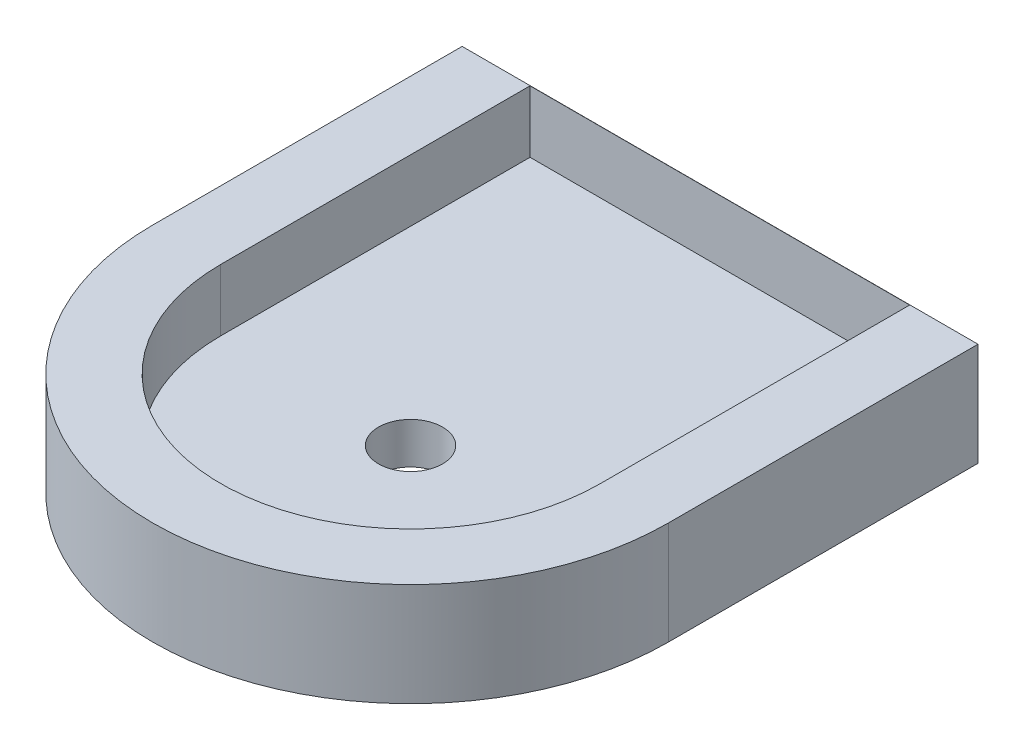
ISO-10303-21;
HEADER;
FILE_DESCRIPTION(('STEP AP214'),'2;1');
FILE_NAME('part.step','',(''),(''),'','','');
FILE_SCHEMA(('AUTOMOTIVE_DESIGN { 1 0 10303 214 1 1 1 1 }'));
ENDSEC;
DATA;
#1=APPLICATION_CONTEXT('core data for automotive mechanical design processes');
#2=APPLICATION_PROTOCOL_DEFINITION('international standard','automotive_design',2000,#1);
#3=PRODUCT_CONTEXT('',#1,'mechanical');
#4=PRODUCT('Part','Part','',(#3));
#5=PRODUCT_RELATED_PRODUCT_CATEGORY('part','',(#4));
#6=PRODUCT_DEFINITION_FORMATION('','',#4);
#7=PRODUCT_DEFINITION_CONTEXT('part definition',#1,'design');
#8=PRODUCT_DEFINITION('design','',#6,#7);
#9=PRODUCT_DEFINITION_SHAPE('','',#8);
#10=(LENGTH_UNIT() NAMED_UNIT(*) SI_UNIT(.MILLI.,.METRE.));
#11=(NAMED_UNIT(*) PLANE_ANGLE_UNIT() SI_UNIT($,.RADIAN.));
#12=(NAMED_UNIT(*) SI_UNIT($,.STERADIAN.) SOLID_ANGLE_UNIT());
#13=UNCERTAINTY_MEASURE_WITH_UNIT(LENGTH_MEASURE(1.E-05),#10,'distance_accuracy_value','');
#14=(GEOMETRIC_REPRESENTATION_CONTEXT(3) GLOBAL_UNCERTAINTY_ASSIGNED_CONTEXT((#13)) GLOBAL_UNIT_ASSIGNED_CONTEXT((#10,
#11,#12)) REPRESENTATION_CONTEXT('',''));
#15=CARTESIAN_POINT('',(0.,0.,0.));
#16=DIRECTION('',(0.,0.,1.));
#17=DIRECTION('',(1.,0.,0.));
#18=AXIS2_PLACEMENT_3D('',#15,#16,#17);
#19=CARTESIAN_POINT('',(3.30000000000001,0.,48.));
#20=DIRECTION('',(-1.,0.,0.));
#21=DIRECTION('',(0.,0.,1.));
#22=AXIS2_PLACEMENT_3D('',#19,#20,#21);
#23=PLANE('',#22);
#24=DIRECTION('',(0.,-1.,0.));
#25=VECTOR('',#24,1.);
#26=CARTESIAN_POINT('',(3.30000000000001,23.4000027173911,33.01));
#27=LINE('',#26,#25);
#28=CARTESIAN_POINT('',(3.30000000000001,5.,33.01));
#29=VERTEX_POINT('',#28);
#30=CARTESIAN_POINT('',(3.30000000000001,2.,33.01));
#31=VERTEX_POINT('',#30);
#32=EDGE_CURVE('E103',#29,#31,#27,.T.);
#33=ORIENTED_EDGE('',*,*,#32,.F.);
#34=DIRECTION('',(0.,0.,1.));
#35=VECTOR('',#34,1.);
#36=CARTESIAN_POINT('',(3.30000000000001,5.,48.));
#37=LINE('',#36,#35);
#38=CARTESIAN_POINT('',(3.30000000000001,5.,48.));
#39=VERTEX_POINT('',#38);
#40=EDGE_CURVE('E114',#29,#39,#37,.T.);
#41=ORIENTED_EDGE('',*,*,#40,.T.);
#42=DIRECTION('',(0.,1.,0.));
#43=VECTOR('',#42,1.);
#44=CARTESIAN_POINT('',(3.30000000000001,0.,48.));
#45=LINE('',#44,#43);
#46=CARTESIAN_POINT('',(3.30000000000001,2.,48.));
#47=VERTEX_POINT('',#46);
#48=EDGE_CURVE('E127',#47,#39,#45,.T.);
#49=ORIENTED_EDGE('',*,*,#48,.F.);
#50=DIRECTION('',(0.,0.,-1.));
#51=VECTOR('',#50,1.);
#52=CARTESIAN_POINT('',(3.30000000000001,2.,33.));
#53=LINE('',#52,#51);
#54=EDGE_CURVE('E116',#47,#31,#53,.T.);
#55=ORIENTED_EDGE('',*,*,#54,.T.);
#56=EDGE_LOOP('',(#33,#41,#49,#55));
#57=FACE_BOUND('',#56,.T.);
#58=ADVANCED_FACE('F34',(#57),#23,.F.);
#59=CARTESIAN_POINT('',(21.7,0.,33.));
#60=DIRECTION('',(1.,0.,0.));
#61=DIRECTION('',(0.,0.,-1.));
#62=AXIS2_PLACEMENT_3D('',#59,#60,#61);
#63=PLANE('',#62);
#64=DIRECTION('',(0.,-1.,0.));
#65=VECTOR('',#64,1.);
#66=CARTESIAN_POINT('',(21.7,23.4000027173911,33.01));
#67=LINE('',#66,#65);
#68=CARTESIAN_POINT('',(21.7,5.,33.01));
#69=VERTEX_POINT('',#68);
#70=CARTESIAN_POINT('',(21.7,2.,33.01));
#71=VERTEX_POINT('',#70);
#72=EDGE_CURVE('E105',#69,#71,#67,.T.);
#73=ORIENTED_EDGE('',*,*,#72,.T.);
#74=DIRECTION('',(0.,0.,1.));
#75=VECTOR('',#74,1.);
#76=CARTESIAN_POINT('',(21.7,2.,48.));
#77=LINE('',#76,#75);
#78=CARTESIAN_POINT('',(21.7,2.,48.));
#79=VERTEX_POINT('',#78);
#80=EDGE_CURVE('E57',#71,#79,#77,.T.);
#81=ORIENTED_EDGE('',*,*,#80,.T.);
#82=DIRECTION('',(0.,1.,0.));
#83=VECTOR('',#82,1.);
#84=CARTESIAN_POINT('',(21.7,0.,48.));
#85=LINE('',#84,#83);
#86=CARTESIAN_POINT('',(21.7,5.,48.));
#87=VERTEX_POINT('',#86);
#88=EDGE_CURVE('E124',#79,#87,#85,.T.);
#89=ORIENTED_EDGE('',*,*,#88,.T.);
#90=DIRECTION('',(0.,0.,-1.));
#91=VECTOR('',#90,1.);
#92=CARTESIAN_POINT('',(21.7,5.,33.));
#93=LINE('',#92,#91);
#94=EDGE_CURVE('E125',#87,#69,#93,.T.);
#95=ORIENTED_EDGE('',*,*,#94,.T.);
#96=EDGE_LOOP('',(#73,#81,#89,#95));
#97=FACE_BOUND('',#96,.T.);
#98=ADVANCED_FACE('F175',(#97),#63,.F.);
#99=CARTESIAN_POINT('',(12.5,2.,48.));
#100=DIRECTION('',(0.,-1.,0.));
#101=DIRECTION('',(0.,0.,-1.));
#102=AXIS2_PLACEMENT_3D('',#99,#100,#101);
#103=PLANE('',#102);
#104=CARTESIAN_POINT('',(12.5,2.,48.));
#105=DIRECTION('',(0.,-1.,0.));
#106=DIRECTION('',(0.,0.,-1.));
#107=AXIS2_PLACEMENT_3D('',#104,#105,#106);
#108=CIRCLE('',#107,1.55);
#109=CARTESIAN_POINT('',(12.5,2.,46.45));
#110=VERTEX_POINT('',#109);
#111=EDGE_CURVE('E179',#110,#110,#108,.T.);
#112=ORIENTED_EDGE('',*,*,#111,.T.);
#113=EDGE_LOOP('',(#112));
#114=FACE_BOUND('',#113,.T.);
#115=DIRECTION('',(1.,0.,0.));
#116=VECTOR('',#115,1.);
#117=CARTESIAN_POINT('',(3.30000000000001,2.,33.01));
#118=LINE('',#117,#116);
#119=EDGE_CURVE('E117',#31,#71,#118,.T.);
#120=ORIENTED_EDGE('',*,*,#119,.F.);
#121=ORIENTED_EDGE('',*,*,#54,.F.);
#122=CARTESIAN_POINT('',(12.5,2.,48.));
#123=DIRECTION('',(0.,-1.,0.));
#124=DIRECTION('',(0.,0.,-1.));
#125=AXIS2_PLACEMENT_3D('',#122,#123,#124);
#126=CIRCLE('',#125,9.2);
#127=EDGE_CURVE('E49',#79,#47,#126,.T.);
#128=ORIENTED_EDGE('',*,*,#127,.F.);
#129=ORIENTED_EDGE('',*,*,#80,.F.);
#130=EDGE_LOOP('',(#120,#121,#128,#129));
#131=FACE_BOUND('',#130,.T.);
#132=ADVANCED_FACE('F178',(#114,#131),#103,.F.);
#133=CARTESIAN_POINT('',(12.5,0.,48.));
#134=DIRECTION('',(0.,1.,0.));
#135=DIRECTION('',(0.,0.,1.));
#136=AXIS2_PLACEMENT_3D('',#133,#134,#135);
#137=CYLINDRICAL_SURFACE('',#136,9.2);
#138=ORIENTED_EDGE('',*,*,#127,.T.);
#139=ORIENTED_EDGE('',*,*,#48,.T.);
#140=CARTESIAN_POINT('',(12.5,5.,48.));
#141=DIRECTION('',(0.,1.,0.));
#142=DIRECTION('',(0.,0.,1.));
#143=AXIS2_PLACEMENT_3D('',#140,#141,#142);
#144=CIRCLE('',#143,9.2);
#145=EDGE_CURVE('E123',#39,#87,#144,.T.);
#146=ORIENTED_EDGE('',*,*,#145,.T.);
#147=ORIENTED_EDGE('',*,*,#88,.F.);
#148=EDGE_LOOP('',(#138,#139,#146,#147));
#149=FACE_BOUND('',#148,.T.);
#150=ADVANCED_FACE('F174',(#149),#137,.F.);
#151=CARTESIAN_POINT('',(12.5,5.,48.));
#152=DIRECTION('',(0.,1.,0.));
#153=DIRECTION('',(0.,0.,1.));
#154=AXIS2_PLACEMENT_3D('',#151,#152,#153);
#155=PLANE('',#154);
#156=ORIENTED_EDGE('',*,*,#40,.F.);
#157=DIRECTION('',(1.,0.,0.));
#158=VECTOR('',#157,1.);
#159=CARTESIAN_POINT('',(3.30000000000001,5.,33.01));
#160=LINE('',#159,#158);
#161=EDGE_CURVE('E100',#29,#69,#160,.T.);
#162=ORIENTED_EDGE('',*,*,#161,.T.);
#163=ORIENTED_EDGE('',*,*,#94,.F.);
#164=ORIENTED_EDGE('',*,*,#145,.F.);
#165=EDGE_LOOP('',(#156,#162,#163,#164));
#166=FACE_BOUND('',#165,.T.);
#167=DIRECTION('',(0.,0.,-1.));
#168=VECTOR('',#167,1.);
#169=CARTESIAN_POINT('',(25.,5.,48.));
#170=LINE('',#169,#168);
#171=CARTESIAN_POINT('',(25.,5.,48.));
#172=VERTEX_POINT('',#171);
#173=CARTESIAN_POINT('',(25.,5.,33.));
#174=VERTEX_POINT('',#173);
#175=EDGE_CURVE('E139',#172,#174,#170,.T.);
#176=ORIENTED_EDGE('',*,*,#175,.T.);
#177=DIRECTION('',(-1.,0.,0.));
#178=VECTOR('',#177,1.);
#179=CARTESIAN_POINT('',(0.,5.,33.));
#180=LINE('',#179,#178);
#181=CARTESIAN_POINT('',(0.,5.,33.));
#182=VERTEX_POINT('',#181);
#183=EDGE_CURVE('E165',#174,#182,#180,.T.);
#184=ORIENTED_EDGE('',*,*,#183,.T.);
#185=DIRECTION('',(0.,0.,1.));
#186=VECTOR('',#185,1.);
#187=CARTESIAN_POINT('',(0.,5.,0.));
#188=LINE('',#187,#186);
#189=CARTESIAN_POINT('',(0.,5.,48.));
#190=VERTEX_POINT('',#189);
#191=EDGE_CURVE('E134',#182,#190,#188,.T.);
#192=ORIENTED_EDGE('',*,*,#191,.T.);
#193=CARTESIAN_POINT('',(12.5,5.,48.));
#194=DIRECTION('',(0.,1.,0.));
#195=DIRECTION('',(0.,0.,1.));
#196=AXIS2_PLACEMENT_3D('',#193,#194,#195);
#197=CIRCLE('',#196,12.5);
#198=EDGE_CURVE('E136',#190,#172,#197,.T.);
#199=ORIENTED_EDGE('',*,*,#198,.T.);
#200=EDGE_LOOP('',(#176,#184,#192,#199));
#201=FACE_BOUND('',#200,.T.);
#202=ADVANCED_FACE('F120',(#166,#201),#155,.T.);
#203=CARTESIAN_POINT('',(12.5,0.,48.));
#204=DIRECTION('',(0.,1.,0.));
#205=DIRECTION('',(0.,0.,1.));
#206=AXIS2_PLACEMENT_3D('',#203,#204,#205);
#207=PLANE('',#206);
#208=DIRECTION('',(-1.,0.,0.));
#209=VECTOR('',#208,1.);
#210=CARTESIAN_POINT('',(0.,0.,33.));
#211=LINE('',#210,#209);
#212=CARTESIAN_POINT('',(25.,0.,33.));
#213=VERTEX_POINT('',#212);
#214=CARTESIAN_POINT('',(0.,0.,33.));
#215=VERTEX_POINT('',#214);
#216=EDGE_CURVE('E161',#213,#215,#211,.T.);
#217=ORIENTED_EDGE('',*,*,#216,.F.);
#218=DIRECTION('',(0.,0.,-1.));
#219=VECTOR('',#218,1.);
#220=CARTESIAN_POINT('',(25.,0.,48.));
#221=LINE('',#220,#219);
#222=CARTESIAN_POINT('',(25.,0.,48.));
#223=VERTEX_POINT('',#222);
#224=EDGE_CURVE('E137',#223,#213,#221,.T.);
#225=ORIENTED_EDGE('',*,*,#224,.F.);
#226=CARTESIAN_POINT('',(12.5,0.,48.));
#227=DIRECTION('',(0.,1.,0.));
#228=DIRECTION('',(0.,0.,1.));
#229=AXIS2_PLACEMENT_3D('',#226,#227,#228);
#230=CIRCLE('',#229,12.5);
#231=CARTESIAN_POINT('',(0.,0.,48.));
#232=VERTEX_POINT('',#231);
#233=EDGE_CURVE('E143',#232,#223,#230,.T.);
#234=ORIENTED_EDGE('',*,*,#233,.F.);
#235=DIRECTION('',(0.,0.,1.));
#236=VECTOR('',#235,1.);
#237=CARTESIAN_POINT('',(0.,0.,0.));
#238=LINE('',#237,#236);
#239=EDGE_CURVE('E132',#215,#232,#238,.T.);
#240=ORIENTED_EDGE('',*,*,#239,.F.);
#241=EDGE_LOOP('',(#217,#225,#234,#240));
#242=FACE_BOUND('',#241,.T.);
#243=CARTESIAN_POINT('',(12.5,0.,48.));
#244=DIRECTION('',(0.,-1.,0.));
#245=DIRECTION('',(0.,0.,-1.));
#246=AXIS2_PLACEMENT_3D('',#243,#244,#245);
#247=CIRCLE('',#246,1.55);
#248=CARTESIAN_POINT('',(12.5,0.,46.45));
#249=VERTEX_POINT('',#248);
#250=EDGE_CURVE('E110',#249,#249,#247,.T.);
#251=ORIENTED_EDGE('',*,*,#250,.F.);
#252=EDGE_LOOP('',(#251));
#253=FACE_BOUND('',#252,.T.);
#254=ADVANCED_FACE('F158',(#242,#253),#207,.F.);
#255=CARTESIAN_POINT('',(0.,5.,0.));
#256=DIRECTION('',(1.,0.,0.));
#257=DIRECTION('',(0.,0.,-1.));
#258=AXIS2_PLACEMENT_3D('',#255,#256,#257);
#259=PLANE('',#258);
#260=DIRECTION('',(0.,1.,0.));
#261=VECTOR('',#260,1.);
#262=CARTESIAN_POINT('',(0.,0.,33.));
#263=LINE('',#262,#261);
#264=EDGE_CURVE('E167',#215,#182,#263,.T.);
#265=ORIENTED_EDGE('',*,*,#264,.F.);
#266=ORIENTED_EDGE('',*,*,#239,.T.);
#267=DIRECTION('',(0.,-1.,0.));
#268=VECTOR('',#267,1.);
#269=CARTESIAN_POINT('',(0.,5.,48.));
#270=LINE('',#269,#268);
#271=EDGE_CURVE('E12',#190,#232,#270,.T.);
#272=ORIENTED_EDGE('',*,*,#271,.F.);
#273=ORIENTED_EDGE('',*,*,#191,.F.);
#274=EDGE_LOOP('',(#265,#266,#272,#273));
#275=FACE_BOUND('',#274,.T.);
#276=ADVANCED_FACE('F36',(#275),#259,.F.);
#277=CARTESIAN_POINT('',(25.,5.,48.));
#278=DIRECTION('',(-1.,0.,0.));
#279=DIRECTION('',(0.,0.,1.));
#280=AXIS2_PLACEMENT_3D('',#277,#278,#279);
#281=PLANE('',#280);
#282=DIRECTION('',(0.,1.,0.));
#283=VECTOR('',#282,1.);
#284=CARTESIAN_POINT('',(25.,0.,33.));
#285=LINE('',#284,#283);
#286=EDGE_CURVE('E164',#213,#174,#285,.T.);
#287=ORIENTED_EDGE('',*,*,#286,.T.);
#288=ORIENTED_EDGE('',*,*,#175,.F.);
#289=DIRECTION('',(0.,-1.,0.));
#290=VECTOR('',#289,1.);
#291=CARTESIAN_POINT('',(25.,5.,48.));
#292=LINE('',#291,#290);
#293=EDGE_CURVE('E42',#172,#223,#292,.T.);
#294=ORIENTED_EDGE('',*,*,#293,.T.);
#295=ORIENTED_EDGE('',*,*,#224,.T.);
#296=EDGE_LOOP('',(#287,#288,#294,#295));
#297=FACE_BOUND('',#296,.T.);
#298=ADVANCED_FACE('F152',(#297),#281,.F.);
#299=CARTESIAN_POINT('',(12.5,5.,48.));
#300=DIRECTION('',(0.,-1.,0.));
#301=DIRECTION('',(0.,0.,-1.));
#302=AXIS2_PLACEMENT_3D('',#299,#300,#301);
#303=CYLINDRICAL_SURFACE('',#302,12.5);
#304=ORIENTED_EDGE('',*,*,#233,.T.);
#305=ORIENTED_EDGE('',*,*,#293,.F.);
#306=ORIENTED_EDGE('',*,*,#198,.F.);
#307=ORIENTED_EDGE('',*,*,#271,.T.);
#308=EDGE_LOOP('',(#304,#305,#306,#307));
#309=FACE_BOUND('',#308,.T.);
#310=ADVANCED_FACE('F232',(#309),#303,.T.);
#311=CARTESIAN_POINT('',(0.,0.,33.));
#312=DIRECTION('',(0.,0.,-1.));
#313=DIRECTION('',(-1.,0.,0.));
#314=AXIS2_PLACEMENT_3D('',#311,#312,#313);
#315=PLANE('',#314);
#316=ORIENTED_EDGE('',*,*,#183,.F.);
#317=ORIENTED_EDGE('',*,*,#286,.F.);
#318=ORIENTED_EDGE('',*,*,#216,.T.);
#319=ORIENTED_EDGE('',*,*,#264,.T.);
#320=EDGE_LOOP('',(#316,#317,#318,#319));
#321=FACE_BOUND('',#320,.T.);
#322=ADVANCED_FACE('F205',(#321),#315,.T.);
#323=CARTESIAN_POINT('',(12.5,2.,48.));
#324=DIRECTION('',(0.,-1.,0.));
#325=DIRECTION('',(0.,0.,-1.));
#326=AXIS2_PLACEMENT_3D('',#323,#324,#325);
#327=CYLINDRICAL_SURFACE('',#326,1.55);
#328=ORIENTED_EDGE('',*,*,#111,.F.);
#329=EDGE_LOOP('',(#328));
#330=FACE_BOUND('',#329,.T.);
#331=ORIENTED_EDGE('',*,*,#250,.T.);
#332=EDGE_LOOP('',(#331));
#333=FACE_BOUND('',#332,.T.);
#334=ADVANCED_FACE('F188',(#330,#333),#327,.F.);
#335=CARTESIAN_POINT('',(3.30000000000001,23.4000027173911,33.01));
#336=DIRECTION('',(0.,0.,-1.));
#337=DIRECTION('',(-1.,0.,0.));
#338=AXIS2_PLACEMENT_3D('',#335,#336,#337);
#339=PLANE('',#338);
#340=ORIENTED_EDGE('',*,*,#161,.F.);
#341=ORIENTED_EDGE('',*,*,#32,.T.);
#342=ORIENTED_EDGE('',*,*,#119,.T.);
#343=ORIENTED_EDGE('',*,*,#72,.F.);
#344=EDGE_LOOP('',(#340,#341,#342,#343));
#345=FACE_BOUND('',#344,.T.);
#346=ADVANCED_FACE('F102',(#345),#339,.F.);
#347=CLOSED_SHELL('',(#58,#98,#132,#150,#202,#254,#276,#298,#310,#322,#334,#346));
#348=MANIFOLD_SOLID_BREP('B2',#347);
#349=ADVANCED_BREP_SHAPE_REPRESENTATION('',(#18,#348),#14);
#350=SHAPE_DEFINITION_REPRESENTATION(#9,#349);
ENDSEC;
END-ISO-10303-21;
